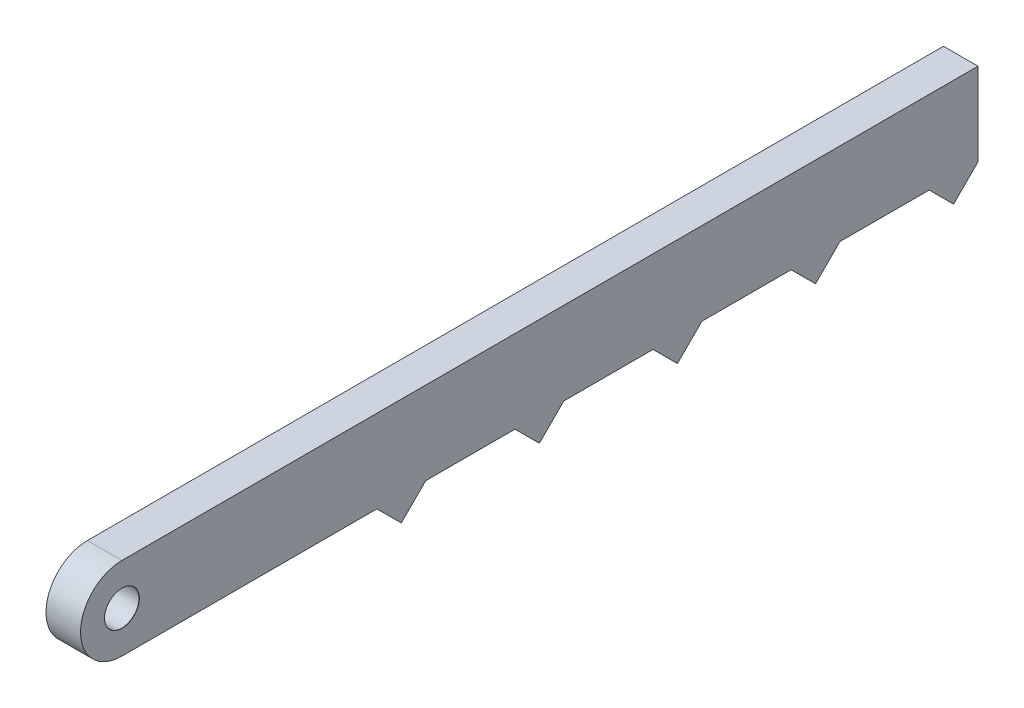
ISO-10303-21;
HEADER;
FILE_DESCRIPTION(('STEP AP214'),'2;1');
FILE_NAME('part.step','',(''),(''),'','','');
FILE_SCHEMA(('AUTOMOTIVE_DESIGN { 1 0 10303 214 1 1 1 1 }'));
ENDSEC;
DATA;
#1=APPLICATION_CONTEXT('core data for automotive mechanical design processes');
#2=APPLICATION_PROTOCOL_DEFINITION('international standard','automotive_design',2000,#1);
#3=PRODUCT_CONTEXT('',#1,'mechanical');
#4=PRODUCT('Part','Part','',(#3));
#5=PRODUCT_RELATED_PRODUCT_CATEGORY('part','',(#4));
#6=PRODUCT_DEFINITION_FORMATION('','',#4);
#7=PRODUCT_DEFINITION_CONTEXT('part definition',#1,'design');
#8=PRODUCT_DEFINITION('design','',#6,#7);
#9=PRODUCT_DEFINITION_SHAPE('','',#8);
#10=(LENGTH_UNIT() NAMED_UNIT(*) SI_UNIT(.MILLI.,.METRE.));
#11=(NAMED_UNIT(*) PLANE_ANGLE_UNIT() SI_UNIT($,.RADIAN.));
#12=(NAMED_UNIT(*) SI_UNIT($,.STERADIAN.) SOLID_ANGLE_UNIT());
#13=UNCERTAINTY_MEASURE_WITH_UNIT(LENGTH_MEASURE(1.E-05),#10,'distance_accuracy_value','');
#14=(GEOMETRIC_REPRESENTATION_CONTEXT(3) GLOBAL_UNCERTAINTY_ASSIGNED_CONTEXT((#13)) GLOBAL_UNIT_ASSIGNED_CONTEXT((#10,
#11,#12)) REPRESENTATION_CONTEXT('',''));
#15=CARTESIAN_POINT('',(0.,0.,0.));
#16=DIRECTION('',(0.,0.,1.));
#17=DIRECTION('',(1.,0.,0.));
#18=AXIS2_PLACEMENT_3D('',#15,#16,#17);
#19=CARTESIAN_POINT('',(0.,0.,0.));
#20=DIRECTION('',(-1.,0.,0.));
#21=DIRECTION('',(0.,0.,1.));
#22=AXIS2_PLACEMENT_3D('',#19,#20,#21);
#23=PLANE('',#22);
#24=DIRECTION('',(0.,0.,-1.));
#25=VECTOR('',#24,1.);
#26=CARTESIAN_POINT('',(0.,-12.,-130.));
#27=LINE('',#26,#25);
#28=CARTESIAN_POINT('',(0.,-12.,-6.00000000000001));
#29=VERTEX_POINT('',#28);
#30=CARTESIAN_POINT('',(0.,-12.,-42.928932188134));
#31=VERTEX_POINT('',#30);
#32=EDGE_CURVE('E203',#29,#31,#27,.T.);
#33=ORIENTED_EDGE('',*,*,#32,.F.);
#34=CARTESIAN_POINT('',(0.,-6.00000000000001,-6.00000000000001));
#35=DIRECTION('',(1.,0.,0.));
#36=DIRECTION('',(0.,0.,-1.));
#37=AXIS2_PLACEMENT_3D('',#34,#35,#36);
#38=CIRCLE('',#37,6.00000000000001);
#39=CARTESIAN_POINT('',(0.,0.,-6.00000000000001));
#40=VERTEX_POINT('',#39);
#41=EDGE_CURVE('E189',#40,#29,#38,.T.);
#42=ORIENTED_EDGE('',*,*,#41,.F.);
#43=DIRECTION('',(0.,0.,1.));
#44=VECTOR('',#43,1.);
#45=CARTESIAN_POINT('',(0.,0.,0.));
#46=LINE('',#45,#44);
#47=CARTESIAN_POINT('',(0.,0.,-130.));
#48=VERTEX_POINT('',#47);
#49=EDGE_CURVE('E221',#48,#40,#46,.T.);
#50=ORIENTED_EDGE('',*,*,#49,.F.);
#51=DIRECTION('',(0.,1.,0.));
#52=VECTOR('',#51,1.);
#53=CARTESIAN_POINT('',(0.,0.,-130.));
#54=LINE('',#53,#52);
#55=CARTESIAN_POINT('',(0.,-12.,-130.));
#56=VERTEX_POINT('',#55);
#57=EDGE_CURVE('E215',#56,#48,#54,.T.);
#58=ORIENTED_EDGE('',*,*,#57,.F.);
#59=DIRECTION('',(0.,0.70710678118655,-0.707106781186545));
#60=VECTOR('',#59,1.);
#61=CARTESIAN_POINT('',(0.,-12.,-130.));
#62=LINE('',#61,#60);
#63=CARTESIAN_POINT('',(0.,-15.5355339059328,-126.464466094067));
#64=VERTEX_POINT('',#63);
#65=EDGE_CURVE('E241',#64,#56,#62,.T.);
#66=ORIENTED_EDGE('',*,*,#65,.F.);
#67=DIRECTION('',(0.,-0.707106781186543,-0.707106781186551));
#68=VECTOR('',#67,1.);
#69=CARTESIAN_POINT('',(0.,-15.5355339059328,-126.464466094067));
#70=LINE('',#69,#68);
#71=CARTESIAN_POINT('',(0.,-12.,-122.928932188134));
#72=VERTEX_POINT('',#71);
#73=EDGE_CURVE('E358',#72,#64,#70,.T.);
#74=ORIENTED_EDGE('',*,*,#73,.F.);
#75=CARTESIAN_POINT('',(0.,-12.0000000000001,-110.));
#76=VERTEX_POINT('',#75);
#77=EDGE_CURVE('E218',#76,#72,#27,.T.);
#78=ORIENTED_EDGE('',*,*,#77,.F.);
#79=DIRECTION('',(0.,0.707106781186549,-0.707106781186546));
#80=VECTOR('',#79,1.);
#81=CARTESIAN_POINT('',(0.,-12.0000000000001,-110.));
#82=LINE('',#81,#80);
#83=CARTESIAN_POINT('',(0.,-15.5355339059329,-106.464466094067));
#84=VERTEX_POINT('',#83);
#85=EDGE_CURVE('E337',#84,#76,#82,.T.);
#86=ORIENTED_EDGE('',*,*,#85,.F.);
#87=DIRECTION('',(0.,-0.707106781186545,-0.70710678118655));
#88=VECTOR('',#87,1.);
#89=CARTESIAN_POINT('',(0.,-15.5355339059329,-106.464466094067));
#90=LINE('',#89,#88);
#91=CARTESIAN_POINT('',(0.,-12.,-102.928932188134));
#92=VERTEX_POINT('',#91);
#93=EDGE_CURVE('E348',#92,#84,#90,.T.);
#94=ORIENTED_EDGE('',*,*,#93,.F.);
#95=CARTESIAN_POINT('',(0.,-12.0000000000003,-90.));
#96=VERTEX_POINT('',#95);
#97=EDGE_CURVE('E226',#96,#92,#27,.T.);
#98=ORIENTED_EDGE('',*,*,#97,.F.);
#99=DIRECTION('',(0.,0.707106781186547,-0.707106781186548));
#100=VECTOR('',#99,1.);
#101=CARTESIAN_POINT('',(0.,-12.0000000000003,-90.));
#102=LINE('',#101,#100);
#103=CARTESIAN_POINT('',(0.,-15.535533905933,-86.4644660940673));
#104=VERTEX_POINT('',#103);
#105=EDGE_CURVE('E317',#104,#96,#102,.T.);
#106=ORIENTED_EDGE('',*,*,#105,.F.);
#107=DIRECTION('',(0.,-0.707106781186546,-0.707106781186549));
#108=VECTOR('',#107,1.);
#109=CARTESIAN_POINT('',(0.,-15.535533905933,-86.4644660940673));
#110=LINE('',#109,#108);
#111=CARTESIAN_POINT('',(0.,-12.,-82.9289321881343));
#112=VERTEX_POINT('',#111);
#113=EDGE_CURVE('E324',#112,#104,#110,.T.);
#114=ORIENTED_EDGE('',*,*,#113,.F.);
#115=CARTESIAN_POINT('',(0.,-12.0000000000004,-70.));
#116=VERTEX_POINT('',#115);
#117=EDGE_CURVE('E223',#116,#112,#27,.T.);
#118=ORIENTED_EDGE('',*,*,#117,.F.);
#119=DIRECTION('',(0.,0.707106781186547,-0.707106781186548));
#120=VECTOR('',#119,1.);
#121=CARTESIAN_POINT('',(0.,-12.0000000000004,-70.));
#122=LINE('',#121,#120);
#123=CARTESIAN_POINT('',(0.,-15.5355339059332,-66.4644660940673));
#124=VERTEX_POINT('',#123);
#125=EDGE_CURVE('E292',#124,#116,#122,.T.);
#126=ORIENTED_EDGE('',*,*,#125,.F.);
#127=DIRECTION('',(0.,-0.707106781186546,-0.707106781186549));
#128=VECTOR('',#127,1.);
#129=CARTESIAN_POINT('',(0.,-15.5355339059332,-66.4644660940673));
#130=LINE('',#129,#128);
#131=CARTESIAN_POINT('',(0.,-12.,-62.9289321881341));
#132=VERTEX_POINT('',#131);
#133=EDGE_CURVE('E305',#132,#124,#130,.T.);
#134=ORIENTED_EDGE('',*,*,#133,.F.);
#135=CARTESIAN_POINT('',(0.,-12.0000000000006,-50.));
#136=VERTEX_POINT('',#135);
#137=EDGE_CURVE('E216',#136,#132,#27,.T.);
#138=ORIENTED_EDGE('',*,*,#137,.F.);
#139=DIRECTION('',(0.,0.707106781186546,-0.707106781186549));
#140=VECTOR('',#139,1.);
#141=CARTESIAN_POINT('',(0.,-12.0000000000006,-50.));
#142=LINE('',#141,#140);
#143=CARTESIAN_POINT('',(0.,-15.5355339059333,-46.4644660940673));
#144=VERTEX_POINT('',#143);
#145=EDGE_CURVE('E383',#144,#136,#142,.T.);
#146=ORIENTED_EDGE('',*,*,#145,.F.);
#147=DIRECTION('',(0.,-0.707106781186548,-0.707106781186547));
#148=VECTOR('',#147,1.);
#149=CARTESIAN_POINT('',(0.,-15.5355339059333,-46.4644660940673));
#150=LINE('',#149,#148);
#151=EDGE_CURVE('E213',#31,#144,#150,.T.);
#152=ORIENTED_EDGE('',*,*,#151,.F.);
#153=EDGE_LOOP('',(#33,#42,#50,#58,#66,#74,#78,#86,#94,#98,#106,#114,#118,#126,#134,#138,#146,#152));
#154=FACE_BOUND('',#153,.T.);
#155=CARTESIAN_POINT('',(0.,-6.,-6.));
#156=DIRECTION('',(1.,0.,0.));
#157=DIRECTION('',(0.,0.,-1.));
#158=AXIS2_PLACEMENT_3D('',#155,#156,#157);
#159=CIRCLE('',#158,2.5);
#160=CARTESIAN_POINT('',(0.,-6.,-8.5));
#161=VERTEX_POINT('',#160);
#162=EDGE_CURVE('E207',#161,#161,#159,.T.);
#163=ORIENTED_EDGE('',*,*,#162,.T.);
#164=EDGE_LOOP('',(#163));
#165=FACE_BOUND('',#164,.T.);
#166=ADVANCED_FACE('F64',(#154,#165),#23,.T.);
#167=CARTESIAN_POINT('',(5.,0.,0.));
#168=DIRECTION('',(-1.,0.,0.));
#169=DIRECTION('',(0.,0.,1.));
#170=AXIS2_PLACEMENT_3D('',#167,#168,#169);
#171=PLANE('',#170);
#172=CARTESIAN_POINT('',(5.,-6.,-6.));
#173=DIRECTION('',(1.,0.,0.));
#174=DIRECTION('',(0.,0.,-1.));
#175=AXIS2_PLACEMENT_3D('',#172,#173,#174);
#176=CIRCLE('',#175,2.525);
#177=CARTESIAN_POINT('',(5.,-6.,-8.525));
#178=VERTEX_POINT('',#177);
#179=EDGE_CURVE('E656',#178,#178,#176,.T.);
#180=ORIENTED_EDGE('',*,*,#179,.F.);
#181=EDGE_LOOP('',(#180));
#182=FACE_BOUND('',#181,.T.);
#183=CARTESIAN_POINT('',(5.,-6.00000000000001,-6.00000000000001));
#184=DIRECTION('',(1.,0.,0.));
#185=DIRECTION('',(0.,0.,-1.));
#186=AXIS2_PLACEMENT_3D('',#183,#184,#185);
#187=CIRCLE('',#186,6.00000000000001);
#188=CARTESIAN_POINT('',(5.,0.,-6.00000000000001));
#189=VERTEX_POINT('',#188);
#190=CARTESIAN_POINT('',(5.,-12.,-6.00000000000001));
#191=VERTEX_POINT('',#190);
#192=EDGE_CURVE('E199',#189,#191,#187,.T.);
#193=ORIENTED_EDGE('',*,*,#192,.T.);
#194=DIRECTION('',(0.,0.,-1.));
#195=VECTOR('',#194,1.);
#196=CARTESIAN_POINT('',(5.,-12.,-130.));
#197=LINE('',#196,#195);
#198=CARTESIAN_POINT('',(5.,-12.,-42.928932188134));
#199=VERTEX_POINT('',#198);
#200=EDGE_CURVE('E205',#191,#199,#197,.T.);
#201=ORIENTED_EDGE('',*,*,#200,.T.);
#202=DIRECTION('',(0.,-0.707106781186548,-0.707106781186547));
#203=VECTOR('',#202,1.);
#204=CARTESIAN_POINT('',(5.,-15.5355339059333,-46.4644660940673));
#205=LINE('',#204,#203);
#206=CARTESIAN_POINT('',(5.,-15.5355339059333,-46.4644660940673));
#207=VERTEX_POINT('',#206);
#208=EDGE_CURVE('E388',#199,#207,#205,.T.);
#209=ORIENTED_EDGE('',*,*,#208,.T.);
#210=DIRECTION('',(0.,0.707106781186546,-0.707106781186549));
#211=VECTOR('',#210,1.);
#212=CARTESIAN_POINT('',(5.,-12.0000000000006,-50.));
#213=LINE('',#212,#211);
#214=CARTESIAN_POINT('',(5.,-12.,-50.0000000000006));
#215=VERTEX_POINT('',#214);
#216=EDGE_CURVE('E284',#207,#215,#213,.T.);
#217=ORIENTED_EDGE('',*,*,#216,.T.);
#218=CARTESIAN_POINT('',(5.,-12.,-62.9289321881341));
#219=VERTEX_POINT('',#218);
#220=EDGE_CURVE('E88',#215,#219,#197,.T.);
#221=ORIENTED_EDGE('',*,*,#220,.T.);
#222=DIRECTION('',(0.,-0.707106781186546,-0.707106781186549));
#223=VECTOR('',#222,1.);
#224=CARTESIAN_POINT('',(5.,-15.5355339059332,-66.4644660940673));
#225=LINE('',#224,#223);
#226=CARTESIAN_POINT('',(5.,-15.5355339059332,-66.4644660940673));
#227=VERTEX_POINT('',#226);
#228=EDGE_CURVE('E280',#219,#227,#225,.T.);
#229=ORIENTED_EDGE('',*,*,#228,.T.);
#230=DIRECTION('',(0.,0.707106781186547,-0.707106781186548));
#231=VECTOR('',#230,1.);
#232=CARTESIAN_POINT('',(5.,-12.0000000000004,-70.));
#233=LINE('',#232,#231);
#234=CARTESIAN_POINT('',(5.,-12.,-70.0000000000005));
#235=VERTEX_POINT('',#234);
#236=EDGE_CURVE('E298',#227,#235,#233,.T.);
#237=ORIENTED_EDGE('',*,*,#236,.T.);
#238=CARTESIAN_POINT('',(5.,-12.,-82.9289321881343));
#239=VERTEX_POINT('',#238);
#240=EDGE_CURVE('E267',#235,#239,#197,.T.);
#241=ORIENTED_EDGE('',*,*,#240,.T.);
#242=DIRECTION('',(0.,-0.707106781186546,-0.707106781186549));
#243=VECTOR('',#242,1.);
#244=CARTESIAN_POINT('',(5.,-15.535533905933,-86.4644660940673));
#245=LINE('',#244,#243);
#246=CARTESIAN_POINT('',(5.,-15.535533905933,-86.4644660940673));
#247=VERTEX_POINT('',#246);
#248=EDGE_CURVE('E323',#239,#247,#245,.T.);
#249=ORIENTED_EDGE('',*,*,#248,.T.);
#250=DIRECTION('',(0.,0.707106781186547,-0.707106781186548));
#251=VECTOR('',#250,1.);
#252=CARTESIAN_POINT('',(5.,-12.0000000000003,-90.));
#253=LINE('',#252,#251);
#254=CARTESIAN_POINT('',(5.,-12.,-90.0000000000004));
#255=VERTEX_POINT('',#254);
#256=EDGE_CURVE('E320',#247,#255,#253,.T.);
#257=ORIENTED_EDGE('',*,*,#256,.T.);
#258=CARTESIAN_POINT('',(5.,-12.,-102.928932188134));
#259=VERTEX_POINT('',#258);
#260=EDGE_CURVE('E264',#255,#259,#197,.T.);
#261=ORIENTED_EDGE('',*,*,#260,.T.);
#262=DIRECTION('',(0.,-0.707106781186545,-0.70710678118655));
#263=VECTOR('',#262,1.);
#264=CARTESIAN_POINT('',(5.,-15.5355339059329,-106.464466094067));
#265=LINE('',#264,#263);
#266=CARTESIAN_POINT('',(5.,-15.5355339059329,-106.464466094067));
#267=VERTEX_POINT('',#266);
#268=EDGE_CURVE('E347',#259,#267,#265,.T.);
#269=ORIENTED_EDGE('',*,*,#268,.T.);
#270=DIRECTION('',(0.,0.707106781186549,-0.707106781186546));
#271=VECTOR('',#270,1.);
#272=CARTESIAN_POINT('',(5.,-12.0000000000001,-110.));
#273=LINE('',#272,#271);
#274=CARTESIAN_POINT('',(5.,-12.,-110.));
#275=VERTEX_POINT('',#274);
#276=EDGE_CURVE('E344',#267,#275,#273,.T.);
#277=ORIENTED_EDGE('',*,*,#276,.T.);
#278=CARTESIAN_POINT('',(5.,-12.,-122.928932188134));
#279=VERTEX_POINT('',#278);
#280=EDGE_CURVE('E250',#275,#279,#197,.T.);
#281=ORIENTED_EDGE('',*,*,#280,.T.);
#282=DIRECTION('',(0.,-0.707106781186543,-0.707106781186551));
#283=VECTOR('',#282,1.);
#284=CARTESIAN_POINT('',(5.,-15.5355339059328,-126.464466094067));
#285=LINE('',#284,#283);
#286=CARTESIAN_POINT('',(5.,-15.5355339059328,-126.464466094067));
#287=VERTEX_POINT('',#286);
#288=EDGE_CURVE('E351',#279,#287,#285,.T.);
#289=ORIENTED_EDGE('',*,*,#288,.T.);
#290=DIRECTION('',(0.,0.70710678118655,-0.707106781186545));
#291=VECTOR('',#290,1.);
#292=CARTESIAN_POINT('',(5.,-12.,-130.));
#293=LINE('',#292,#291);
#294=CARTESIAN_POINT('',(5.,-12.,-130.));
#295=VERTEX_POINT('',#294);
#296=EDGE_CURVE('E244',#287,#295,#293,.T.);
#297=ORIENTED_EDGE('',*,*,#296,.T.);
#298=DIRECTION('',(0.,1.,0.));
#299=VECTOR('',#298,1.);
#300=CARTESIAN_POINT('',(5.,0.,-130.));
#301=LINE('',#300,#299);
#302=CARTESIAN_POINT('',(5.,0.,-130.));
#303=VERTEX_POINT('',#302);
#304=EDGE_CURVE('E249',#295,#303,#301,.T.);
#305=ORIENTED_EDGE('',*,*,#304,.T.);
#306=DIRECTION('',(0.,0.,1.));
#307=VECTOR('',#306,1.);
#308=CARTESIAN_POINT('',(5.,0.,0.));
#309=LINE('',#308,#307);
#310=EDGE_CURVE('E252',#303,#189,#309,.T.);
#311=ORIENTED_EDGE('',*,*,#310,.T.);
#312=EDGE_LOOP('',(#193,#201,#209,#217,#221,#229,#237,#241,#249,#257,#261,#269,#277,#281,#289,
#297,#305,#311));
#313=FACE_BOUND('',#312,.T.);
#314=ADVANCED_FACE('F278',(#182,#313),#171,.F.);
#315=CARTESIAN_POINT('',(5.,-12.,-130.));
#316=DIRECTION('',(0.,1.,0.));
#317=DIRECTION('',(0.,0.,1.));
#318=AXIS2_PLACEMENT_3D('',#315,#316,#317);
#319=PLANE('',#318);
#320=DIRECTION('',(1.,0.,0.));
#321=VECTOR('',#320,1.);
#322=CARTESIAN_POINT('',(0.,-12.,-6.00000000000001));
#323=LINE('',#322,#321);
#324=EDGE_CURVE('E192',#29,#191,#323,.T.);
#325=ORIENTED_EDGE('',*,*,#324,.F.);
#326=ORIENTED_EDGE('',*,*,#32,.T.);
#327=DIRECTION('',(1.,0.,0.));
#328=VECTOR('',#327,1.);
#329=CARTESIAN_POINT('',(0.,-12.0000000000006,-42.9289321881345));
#330=LINE('',#329,#328);
#331=EDGE_CURVE('E380',#31,#199,#330,.T.);
#332=ORIENTED_EDGE('',*,*,#331,.T.);
#333=ORIENTED_EDGE('',*,*,#200,.F.);
#334=EDGE_LOOP('',(#325,#326,#332,#333));
#335=FACE_BOUND('',#334,.T.);
#336=ADVANCED_FACE('F66',(#335),#319,.F.);
#337=ORIENTED_EDGE('',*,*,#220,.F.);
#338=DIRECTION('',(1.,0.,0.));
#339=VECTOR('',#338,1.);
#340=CARTESIAN_POINT('',(0.,-12.0000000000006,-50.));
#341=LINE('',#340,#339);
#342=EDGE_CURVE('E373',#136,#215,#341,.T.);
#343=ORIENTED_EDGE('',*,*,#342,.F.);
#344=ORIENTED_EDGE('',*,*,#137,.T.);
#345=DIRECTION('',(1.,0.,0.));
#346=VECTOR('',#345,1.);
#347=CARTESIAN_POINT('',(0.,-12.0000000000004,-62.9289321881345));
#348=LINE('',#347,#346);
#349=EDGE_CURVE('E286',#132,#219,#348,.T.);
#350=ORIENTED_EDGE('',*,*,#349,.T.);
#351=EDGE_LOOP('',(#337,#343,#344,#350));
#352=FACE_BOUND('',#351,.T.);
#353=ADVANCED_FACE('F287',(#352),#319,.F.);
#354=ORIENTED_EDGE('',*,*,#240,.F.);
#355=DIRECTION('',(1.,0.,0.));
#356=VECTOR('',#355,1.);
#357=CARTESIAN_POINT('',(0.,-12.0000000000004,-70.));
#358=LINE('',#357,#356);
#359=EDGE_CURVE('E391',#116,#235,#358,.T.);
#360=ORIENTED_EDGE('',*,*,#359,.F.);
#361=ORIENTED_EDGE('',*,*,#117,.T.);
#362=DIRECTION('',(1.,0.,0.));
#363=VECTOR('',#362,1.);
#364=CARTESIAN_POINT('',(0.,-12.0000000000003,-82.9289321881345));
#365=LINE('',#364,#363);
#366=EDGE_CURVE('E314',#112,#239,#365,.T.);
#367=ORIENTED_EDGE('',*,*,#366,.T.);
#368=EDGE_LOOP('',(#354,#360,#361,#367));
#369=FACE_BOUND('',#368,.T.);
#370=ADVANCED_FACE('F405',(#369),#319,.F.);
#371=ORIENTED_EDGE('',*,*,#260,.F.);
#372=DIRECTION('',(1.,0.,0.));
#373=VECTOR('',#372,1.);
#374=CARTESIAN_POINT('',(0.,-12.0000000000003,-90.));
#375=LINE('',#374,#373);
#376=EDGE_CURVE('E297',#96,#255,#375,.T.);
#377=ORIENTED_EDGE('',*,*,#376,.F.);
#378=ORIENTED_EDGE('',*,*,#97,.T.);
#379=DIRECTION('',(1.,0.,0.));
#380=VECTOR('',#379,1.);
#381=CARTESIAN_POINT('',(0.,-12.0000000000002,-102.928932188135));
#382=LINE('',#381,#380);
#383=EDGE_CURVE('E334',#92,#259,#382,.T.);
#384=ORIENTED_EDGE('',*,*,#383,.T.);
#385=EDGE_LOOP('',(#371,#377,#378,#384));
#386=FACE_BOUND('',#385,.T.);
#387=ADVANCED_FACE('F417',(#386),#319,.F.);
#388=ORIENTED_EDGE('',*,*,#280,.F.);
#389=DIRECTION('',(1.,0.,0.));
#390=VECTOR('',#389,1.);
#391=CARTESIAN_POINT('',(0.,-12.0000000000001,-110.));
#392=LINE('',#391,#390);
#393=EDGE_CURVE('E327',#76,#275,#392,.T.);
#394=ORIENTED_EDGE('',*,*,#393,.F.);
#395=ORIENTED_EDGE('',*,*,#77,.T.);
#396=DIRECTION('',(1.,0.,0.));
#397=VECTOR('',#396,1.);
#398=CARTESIAN_POINT('',(0.,-12.,-122.928932188134));
#399=LINE('',#398,#397);
#400=EDGE_CURVE('E234',#72,#279,#399,.T.);
#401=ORIENTED_EDGE('',*,*,#400,.T.);
#402=EDGE_LOOP('',(#388,#394,#395,#401));
#403=FACE_BOUND('',#402,.T.);
#404=ADVANCED_FACE('F427',(#403),#319,.F.);
#405=CARTESIAN_POINT('',(5.,0.,-130.));
#406=DIRECTION('',(0.,0.,1.));
#407=DIRECTION('',(1.,0.,0.));
#408=AXIS2_PLACEMENT_3D('',#405,#406,#407);
#409=PLANE('',#408);
#410=ORIENTED_EDGE('',*,*,#57,.T.);
#411=DIRECTION('',(-1.,0.,0.));
#412=VECTOR('',#411,1.);
#413=CARTESIAN_POINT('',(5.,0.,-130.));
#414=LINE('',#413,#412);
#415=EDGE_CURVE('E73',#303,#48,#414,.T.);
#416=ORIENTED_EDGE('',*,*,#415,.F.);
#417=ORIENTED_EDGE('',*,*,#304,.F.);
#418=DIRECTION('',(-1.,0.,0.));
#419=VECTOR('',#418,1.);
#420=CARTESIAN_POINT('',(5.,-12.,-130.));
#421=LINE('',#420,#419);
#422=EDGE_CURVE('E12',#295,#56,#421,.T.);
#423=ORIENTED_EDGE('',*,*,#422,.T.);
#424=EDGE_LOOP('',(#410,#416,#417,#423));
#425=FACE_BOUND('',#424,.T.);
#426=ADVANCED_FACE('F369',(#425),#409,.F.);
#427=CARTESIAN_POINT('',(5.,0.,0.));
#428=DIRECTION('',(0.,-1.,0.));
#429=DIRECTION('',(0.,0.,-1.));
#430=AXIS2_PLACEMENT_3D('',#427,#428,#429);
#431=PLANE('',#430);
#432=ORIENTED_EDGE('',*,*,#49,.T.);
#433=DIRECTION('',(1.,0.,0.));
#434=VECTOR('',#433,1.);
#435=CARTESIAN_POINT('',(0.,0.,-6.00000000000001));
#436=LINE('',#435,#434);
#437=EDGE_CURVE('E80',#40,#189,#436,.T.);
#438=ORIENTED_EDGE('',*,*,#437,.T.);
#439=ORIENTED_EDGE('',*,*,#310,.F.);
#440=ORIENTED_EDGE('',*,*,#415,.T.);
#441=EDGE_LOOP('',(#432,#438,#439,#440));
#442=FACE_BOUND('',#441,.T.);
#443=ADVANCED_FACE('F371',(#442),#431,.F.);
#444=CARTESIAN_POINT('',(0.,-12.,-130.));
#445=DIRECTION('',(0.,-0.707106781186545,-0.70710678118655));
#446=DIRECTION('',(0.,0.70710678118655,-0.707106781186545));
#447=AXIS2_PLACEMENT_3D('',#444,#445,#446);
#448=PLANE('',#447);
#449=ORIENTED_EDGE('',*,*,#296,.F.);
#450=DIRECTION('',(1.,0.,0.));
#451=VECTOR('',#450,1.);
#452=CARTESIAN_POINT('',(0.,-15.5355339059328,-126.464466094067));
#453=LINE('',#452,#451);
#454=EDGE_CURVE('E227',#64,#287,#453,.T.);
#455=ORIENTED_EDGE('',*,*,#454,.F.);
#456=ORIENTED_EDGE('',*,*,#65,.T.);
#457=ORIENTED_EDGE('',*,*,#422,.F.);
#458=EDGE_LOOP('',(#449,#455,#456,#457));
#459=FACE_BOUND('',#458,.T.);
#460=ADVANCED_FACE('F431',(#459),#448,.T.);
#461=CARTESIAN_POINT('',(0.,-15.5355339059328,-126.464466094067));
#462=DIRECTION('',(0.,-0.707106781186551,0.707106781186544));
#463=DIRECTION('',(0.,-0.707106781186544,-0.707106781186551));
#464=AXIS2_PLACEMENT_3D('',#461,#462,#463);
#465=PLANE('',#464);
#466=ORIENTED_EDGE('',*,*,#288,.F.);
#467=ORIENTED_EDGE('',*,*,#400,.F.);
#468=ORIENTED_EDGE('',*,*,#73,.T.);
#469=ORIENTED_EDGE('',*,*,#454,.T.);
#470=EDGE_LOOP('',(#466,#467,#468,#469));
#471=FACE_BOUND('',#470,.T.);
#472=ADVANCED_FACE('F429',(#471),#465,.T.);
#473=CARTESIAN_POINT('',(0.,-12.0000000000001,-110.));
#474=DIRECTION('',(0.,-0.707106781186546,-0.707106781186549));
#475=DIRECTION('',(0.,0.707106781186549,-0.707106781186546));
#476=AXIS2_PLACEMENT_3D('',#473,#474,#475);
#477=PLANE('',#476);
#478=ORIENTED_EDGE('',*,*,#276,.F.);
#479=DIRECTION('',(1.,0.,0.));
#480=VECTOR('',#479,1.);
#481=CARTESIAN_POINT('',(0.,-15.5355339059329,-106.464466094067));
#482=LINE('',#481,#480);
#483=EDGE_CURVE('E338',#84,#267,#482,.T.);
#484=ORIENTED_EDGE('',*,*,#483,.F.);
#485=ORIENTED_EDGE('',*,*,#85,.T.);
#486=ORIENTED_EDGE('',*,*,#393,.T.);
#487=EDGE_LOOP('',(#478,#484,#485,#486));
#488=FACE_BOUND('',#487,.T.);
#489=ADVANCED_FACE('F425',(#488),#477,.T.);
#490=CARTESIAN_POINT('',(0.,-15.5355339059329,-106.464466094067));
#491=DIRECTION('',(0.,-0.70710678118655,0.707106781186545));
#492=DIRECTION('',(0.,-0.707106781186545,-0.70710678118655));
#493=AXIS2_PLACEMENT_3D('',#490,#491,#492);
#494=PLANE('',#493);
#495=ORIENTED_EDGE('',*,*,#268,.F.);
#496=ORIENTED_EDGE('',*,*,#383,.F.);
#497=ORIENTED_EDGE('',*,*,#93,.T.);
#498=ORIENTED_EDGE('',*,*,#483,.T.);
#499=EDGE_LOOP('',(#495,#496,#497,#498));
#500=FACE_BOUND('',#499,.T.);
#501=ADVANCED_FACE('F422',(#500),#494,.T.);
#502=CARTESIAN_POINT('',(0.,-12.0000000000003,-90.));
#503=DIRECTION('',(0.,-0.707106781186548,-0.707106781186547));
#504=DIRECTION('',(0.,0.707106781186547,-0.707106781186548));
#505=AXIS2_PLACEMENT_3D('',#502,#503,#504);
#506=PLANE('',#505);
#507=ORIENTED_EDGE('',*,*,#256,.F.);
#508=DIRECTION('',(1.,0.,0.));
#509=VECTOR('',#508,1.);
#510=CARTESIAN_POINT('',(0.,-15.535533905933,-86.4644660940673));
#511=LINE('',#510,#509);
#512=EDGE_CURVE('E303',#104,#247,#511,.T.);
#513=ORIENTED_EDGE('',*,*,#512,.F.);
#514=ORIENTED_EDGE('',*,*,#105,.T.);
#515=ORIENTED_EDGE('',*,*,#376,.T.);
#516=EDGE_LOOP('',(#507,#513,#514,#515));
#517=FACE_BOUND('',#516,.T.);
#518=ADVANCED_FACE('F413',(#517),#506,.T.);
#519=CARTESIAN_POINT('',(0.,-15.535533905933,-86.4644660940673));
#520=DIRECTION('',(0.,-0.707106781186549,0.707106781186546));
#521=DIRECTION('',(0.,-0.707106781186546,-0.707106781186549));
#522=AXIS2_PLACEMENT_3D('',#519,#520,#521);
#523=PLANE('',#522);
#524=ORIENTED_EDGE('',*,*,#248,.F.);
#525=ORIENTED_EDGE('',*,*,#366,.F.);
#526=ORIENTED_EDGE('',*,*,#113,.T.);
#527=ORIENTED_EDGE('',*,*,#512,.T.);
#528=EDGE_LOOP('',(#524,#525,#526,#527));
#529=FACE_BOUND('',#528,.T.);
#530=ADVANCED_FACE('F410',(#529),#523,.T.);
#531=CARTESIAN_POINT('',(0.,-12.0000000000004,-70.));
#532=DIRECTION('',(0.,-0.707106781186548,-0.707106781186547));
#533=DIRECTION('',(0.,0.707106781186547,-0.707106781186548));
#534=AXIS2_PLACEMENT_3D('',#531,#532,#533);
#535=PLANE('',#534);
#536=ORIENTED_EDGE('',*,*,#236,.F.);
#537=DIRECTION('',(1.,0.,0.));
#538=VECTOR('',#537,1.);
#539=CARTESIAN_POINT('',(0.,-15.5355339059332,-66.4644660940673));
#540=LINE('',#539,#538);
#541=EDGE_CURVE('E293',#124,#227,#540,.T.);
#542=ORIENTED_EDGE('',*,*,#541,.F.);
#543=ORIENTED_EDGE('',*,*,#125,.T.);
#544=ORIENTED_EDGE('',*,*,#359,.T.);
#545=EDGE_LOOP('',(#536,#542,#543,#544));
#546=FACE_BOUND('',#545,.T.);
#547=ADVANCED_FACE('F402',(#546),#535,.T.);
#548=CARTESIAN_POINT('',(0.,-15.5355339059332,-66.4644660940673));
#549=DIRECTION('',(0.,-0.707106781186549,0.707106781186546));
#550=DIRECTION('',(0.,-0.707106781186546,-0.707106781186549));
#551=AXIS2_PLACEMENT_3D('',#548,#549,#550);
#552=PLANE('',#551);
#553=ORIENTED_EDGE('',*,*,#228,.F.);
#554=ORIENTED_EDGE('',*,*,#349,.F.);
#555=ORIENTED_EDGE('',*,*,#133,.T.);
#556=ORIENTED_EDGE('',*,*,#541,.T.);
#557=EDGE_LOOP('',(#553,#554,#555,#556));
#558=FACE_BOUND('',#557,.T.);
#559=ADVANCED_FACE('F295',(#558),#552,.T.);
#560=CARTESIAN_POINT('',(0.,-12.0000000000006,-50.));
#561=DIRECTION('',(0.,-0.707106781186549,-0.707106781186546));
#562=DIRECTION('',(0.,0.707106781186546,-0.707106781186549));
#563=AXIS2_PLACEMENT_3D('',#560,#561,#562);
#564=PLANE('',#563);
#565=ORIENTED_EDGE('',*,*,#216,.F.);
#566=DIRECTION('',(1.,0.,0.));
#567=VECTOR('',#566,1.);
#568=CARTESIAN_POINT('',(0.,-15.5355339059333,-46.4644660940673));
#569=LINE('',#568,#567);
#570=EDGE_CURVE('E376',#144,#207,#569,.T.);
#571=ORIENTED_EDGE('',*,*,#570,.F.);
#572=ORIENTED_EDGE('',*,*,#145,.T.);
#573=ORIENTED_EDGE('',*,*,#342,.T.);
#574=EDGE_LOOP('',(#565,#571,#572,#573));
#575=FACE_BOUND('',#574,.T.);
#576=ADVANCED_FACE('F542',(#575),#564,.T.);
#577=CARTESIAN_POINT('',(0.,-15.5355339059333,-46.4644660940673));
#578=DIRECTION('',(0.,-0.707106781186547,0.707106781186548));
#579=DIRECTION('',(0.,-0.707106781186548,-0.707106781186547));
#580=AXIS2_PLACEMENT_3D('',#577,#578,#579);
#581=PLANE('',#580);
#582=ORIENTED_EDGE('',*,*,#208,.F.);
#583=ORIENTED_EDGE('',*,*,#331,.F.);
#584=ORIENTED_EDGE('',*,*,#151,.T.);
#585=ORIENTED_EDGE('',*,*,#570,.T.);
#586=EDGE_LOOP('',(#582,#583,#584,#585));
#587=FACE_BOUND('',#586,.T.);
#588=ADVANCED_FACE('F491',(#587),#581,.T.);
#589=CARTESIAN_POINT('',(0.,-6.00000000000001,-6.00000000000001));
#590=DIRECTION('',(1.,0.,0.));
#591=DIRECTION('',(0.,0.,-1.));
#592=AXIS2_PLACEMENT_3D('',#589,#590,#591);
#593=CYLINDRICAL_SURFACE('',#592,6.00000000000001);
#594=ORIENTED_EDGE('',*,*,#192,.F.);
#595=ORIENTED_EDGE('',*,*,#437,.F.);
#596=ORIENTED_EDGE('',*,*,#41,.T.);
#597=ORIENTED_EDGE('',*,*,#324,.T.);
#598=EDGE_LOOP('',(#594,#595,#596,#597));
#599=FACE_BOUND('',#598,.T.);
#600=ADVANCED_FACE('F191',(#599),#593,.T.);
#601=CARTESIAN_POINT('',(5.,-6.,-6.));
#602=DIRECTION('',(1.,0.,0.));
#603=DIRECTION('',(0.,0.,-1.));
#604=AXIS2_PLACEMENT_3D('',#601,#602,#603);
#605=CYLINDRICAL_SURFACE('',#604,2.5);
#606=ORIENTED_EDGE('',*,*,#162,.F.);
#607=EDGE_LOOP('',(#606));
#608=FACE_BOUND('',#607,.T.);
#609=CARTESIAN_POINT('',(4.975,-6.,-6.));
#610=DIRECTION('',(1.,0.,0.));
#611=DIRECTION('',(0.,0.,-1.));
#612=AXIS2_PLACEMENT_3D('',#609,#610,#611);
#613=CIRCLE('',#612,2.5);
#614=CARTESIAN_POINT('',(4.975,-6.,-8.5));
#615=VERTEX_POINT('',#614);
#616=EDGE_CURVE('E652',#615,#615,#613,.T.);
#617=ORIENTED_EDGE('',*,*,#616,.T.);
#618=EDGE_LOOP('',(#617));
#619=FACE_BOUND('',#618,.T.);
#620=ADVANCED_FACE('F490',(#608,#619),#605,.F.);
#621=CARTESIAN_POINT('',(5.,-6.,-6.));
#622=DIRECTION('',(1.,0.,0.));
#623=DIRECTION('',(0.,0.,-1.));
#624=AXIS2_PLACEMENT_3D('',#621,#622,#623);
#625=CONICAL_SURFACE('',#624,2.525,0.785398163397379);
#626=ORIENTED_EDGE('',*,*,#616,.F.);
#627=EDGE_LOOP('',(#626));
#628=FACE_BOUND('',#627,.T.);
#629=ORIENTED_EDGE('',*,*,#179,.T.);
#630=EDGE_LOOP('',(#629));
#631=FACE_BOUND('',#630,.T.);
#632=ADVANCED_FACE('F525',(#628,#631),#625,.F.);
#633=CLOSED_SHELL('',(#166,#314,#336,#353,#370,#387,#404,#426,#443,#460,#472,#489,#501,#518,
#530,#547,#559,#576,#588,#600,#620,#632));
#634=MANIFOLD_SOLID_BREP('B2',#633);
#635=ADVANCED_BREP_SHAPE_REPRESENTATION('',(#18,#634),#14);
#636=SHAPE_DEFINITION_REPRESENTATION(#9,#635);
ENDSEC;
END-ISO-10303-21;
